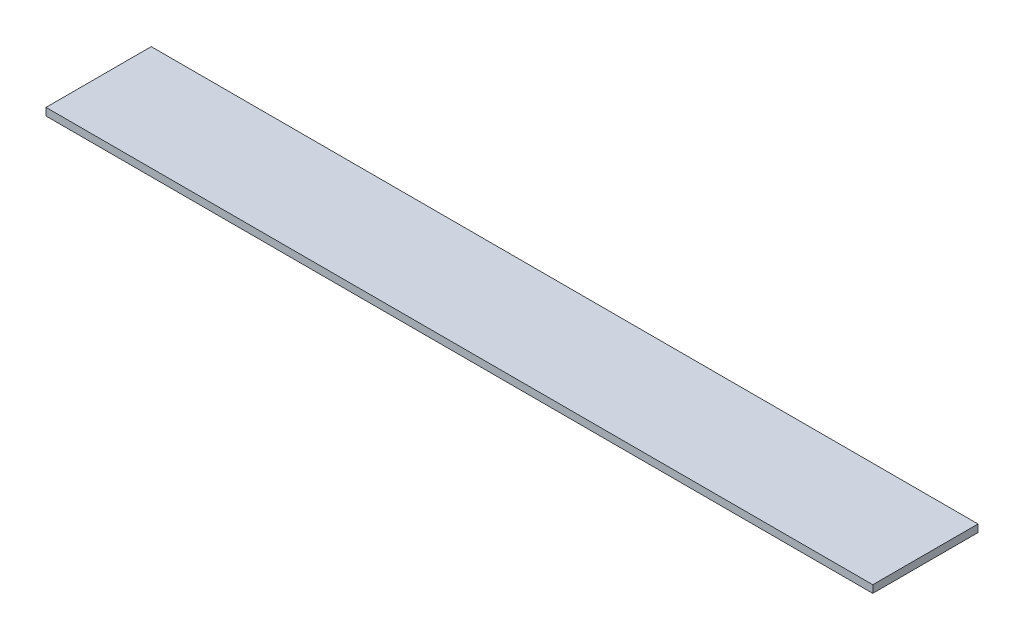
ISO-10303-21;
HEADER;
FILE_DESCRIPTION(('STEP AP214'),'2;1');
FILE_NAME('part.step','',(''),(''),'','','');
FILE_SCHEMA(('AUTOMOTIVE_DESIGN { 1 0 10303 214 1 1 1 1 }'));
ENDSEC;
DATA;
#1=APPLICATION_CONTEXT('core data for automotive mechanical design processes');
#2=APPLICATION_PROTOCOL_DEFINITION('international standard','automotive_design',2000,#1);
#3=PRODUCT_CONTEXT('',#1,'mechanical');
#4=PRODUCT('Part','Part','',(#3));
#5=PRODUCT_RELATED_PRODUCT_CATEGORY('part','',(#4));
#6=PRODUCT_DEFINITION_FORMATION('','',#4);
#7=PRODUCT_DEFINITION_CONTEXT('part definition',#1,'design');
#8=PRODUCT_DEFINITION('design','',#6,#7);
#9=PRODUCT_DEFINITION_SHAPE('','',#8);
#10=(LENGTH_UNIT() NAMED_UNIT(*) SI_UNIT(.MILLI.,.METRE.));
#11=(NAMED_UNIT(*) PLANE_ANGLE_UNIT() SI_UNIT($,.RADIAN.));
#12=(NAMED_UNIT(*) SI_UNIT($,.STERADIAN.) SOLID_ANGLE_UNIT());
#13=UNCERTAINTY_MEASURE_WITH_UNIT(LENGTH_MEASURE(1.E-05),#10,'distance_accuracy_value','');
#14=(GEOMETRIC_REPRESENTATION_CONTEXT(3) GLOBAL_UNCERTAINTY_ASSIGNED_CONTEXT((#13)) GLOBAL_UNIT_ASSIGNED_CONTEXT((#10,
#11,#12)) REPRESENTATION_CONTEXT('',''));
#15=CARTESIAN_POINT('',(0.,0.,0.));
#16=DIRECTION('',(0.,0.,1.));
#17=DIRECTION('',(1.,0.,0.));
#18=AXIS2_PLACEMENT_3D('',#15,#16,#17);
#19=CARTESIAN_POINT('',(698.500000000001,12.7,-88.9000000000002));
#20=DIRECTION('',(1.,0.,0.));
#21=DIRECTION('',(0.,0.,-1.));
#22=AXIS2_PLACEMENT_3D('',#19,#20,#21);
#23=PLANE('',#22);
#24=DIRECTION('',(0.,0.,1.));
#25=VECTOR('',#24,1.);
#26=CARTESIAN_POINT('',(698.500000000001,0.,-88.9000000000002));
#27=LINE('',#26,#25);
#28=CARTESIAN_POINT('',(698.500000000001,0.,-88.9000000000002));
#29=VERTEX_POINT('',#28);
#30=CARTESIAN_POINT('',(698.500000000001,0.,88.8999999999999));
#31=VERTEX_POINT('',#30);
#32=EDGE_CURVE('E98',#29,#31,#27,.T.);
#33=ORIENTED_EDGE('',*,*,#32,.F.);
#34=DIRECTION('',(0.,-1.,0.));
#35=VECTOR('',#34,1.);
#36=CARTESIAN_POINT('',(698.500000000001,12.7,-88.9000000000002));
#37=LINE('',#36,#35);
#38=CARTESIAN_POINT('',(698.500000000001,12.7,-88.9000000000002));
#39=VERTEX_POINT('',#38);
#40=EDGE_CURVE('E11',#39,#29,#37,.T.);
#41=ORIENTED_EDGE('',*,*,#40,.F.);
#42=DIRECTION('',(0.,0.,1.));
#43=VECTOR('',#42,1.);
#44=CARTESIAN_POINT('',(698.500000000001,12.7,-88.9000000000002));
#45=LINE('',#44,#43);
#46=CARTESIAN_POINT('',(698.500000000001,12.7,88.8999999999999));
#47=VERTEX_POINT('',#46);
#48=EDGE_CURVE('E93',#39,#47,#45,.T.);
#49=ORIENTED_EDGE('',*,*,#48,.T.);
#50=DIRECTION('',(0.,-1.,0.));
#51=VECTOR('',#50,1.);
#52=CARTESIAN_POINT('',(698.500000000001,12.7,88.8999999999999));
#53=LINE('',#52,#51);
#54=EDGE_CURVE('E36',#47,#31,#53,.T.);
#55=ORIENTED_EDGE('',*,*,#54,.T.);
#56=EDGE_LOOP('',(#33,#41,#49,#55));
#57=FACE_BOUND('',#56,.T.);
#58=ADVANCED_FACE('F33',(#57),#23,.T.);
#59=CARTESIAN_POINT('',(698.500000000001,12.7,-88.9000000000002));
#60=DIRECTION('',(0.,0.,1.));
#61=DIRECTION('',(1.,0.,0.));
#62=AXIS2_PLACEMENT_3D('',#59,#60,#61);
#63=PLANE('',#62);
#64=DIRECTION('',(-1.,0.,0.));
#65=VECTOR('',#64,1.);
#66=CARTESIAN_POINT('',(698.500000000001,0.,-88.9000000000002));
#67=LINE('',#66,#65);
#68=CARTESIAN_POINT('',(-698.499999999999,0.,-88.8999999999999));
#69=VERTEX_POINT('',#68);
#70=EDGE_CURVE('E66',#29,#69,#67,.T.);
#71=ORIENTED_EDGE('',*,*,#70,.T.);
#72=DIRECTION('',(0.,-1.,0.));
#73=VECTOR('',#72,1.);
#74=CARTESIAN_POINT('',(-698.499999999999,12.7,-88.8999999999999));
#75=LINE('',#74,#73);
#76=CARTESIAN_POINT('',(-698.499999999999,12.7,-88.8999999999999));
#77=VERTEX_POINT('',#76);
#78=EDGE_CURVE('E42',#77,#69,#75,.T.);
#79=ORIENTED_EDGE('',*,*,#78,.F.);
#80=DIRECTION('',(-1.,0.,0.));
#81=VECTOR('',#80,1.);
#82=CARTESIAN_POINT('',(698.500000000001,12.7,-88.9000000000002));
#83=LINE('',#82,#81);
#84=EDGE_CURVE('E83',#39,#77,#83,.T.);
#85=ORIENTED_EDGE('',*,*,#84,.F.);
#86=ORIENTED_EDGE('',*,*,#40,.T.);
#87=EDGE_LOOP('',(#71,#79,#85,#86));
#88=FACE_BOUND('',#87,.T.);
#89=ADVANCED_FACE('F108',(#88),#63,.F.);
#90=CARTESIAN_POINT('',(-698.499999999999,12.7,-88.8999999999999));
#91=DIRECTION('',(1.,0.,0.));
#92=DIRECTION('',(0.,0.,-1.));
#93=AXIS2_PLACEMENT_3D('',#90,#91,#92);
#94=PLANE('',#93);
#95=DIRECTION('',(0.,0.,1.));
#96=VECTOR('',#95,1.);
#97=CARTESIAN_POINT('',(-698.499999999999,0.,-88.8999999999999));
#98=LINE('',#97,#96);
#99=CARTESIAN_POINT('',(-698.499999999999,0.,88.9000000000001));
#100=VERTEX_POINT('',#99);
#101=EDGE_CURVE('E90',#69,#100,#98,.T.);
#102=ORIENTED_EDGE('',*,*,#101,.T.);
#103=DIRECTION('',(0.,-1.,0.));
#104=VECTOR('',#103,1.);
#105=CARTESIAN_POINT('',(-698.499999999999,12.7,88.9000000000001));
#106=LINE('',#105,#104);
#107=CARTESIAN_POINT('',(-698.499999999999,12.7,88.9000000000001));
#108=VERTEX_POINT('',#107);
#109=EDGE_CURVE('E87',#108,#100,#106,.T.);
#110=ORIENTED_EDGE('',*,*,#109,.F.);
#111=DIRECTION('',(0.,0.,1.));
#112=VECTOR('',#111,1.);
#113=CARTESIAN_POINT('',(-698.499999999999,12.7,-88.8999999999999));
#114=LINE('',#113,#112);
#115=EDGE_CURVE('E78',#77,#108,#114,.T.);
#116=ORIENTED_EDGE('',*,*,#115,.F.);
#117=ORIENTED_EDGE('',*,*,#78,.T.);
#118=EDGE_LOOP('',(#102,#110,#116,#117));
#119=FACE_BOUND('',#118,.T.);
#120=ADVANCED_FACE('F88',(#119),#94,.F.);
#121=CARTESIAN_POINT('',(698.500000000001,12.7,88.8999999999999));
#122=DIRECTION('',(0.,0.,1.));
#123=DIRECTION('',(1.,0.,0.));
#124=AXIS2_PLACEMENT_3D('',#121,#122,#123);
#125=PLANE('',#124);
#126=DIRECTION('',(-1.,0.,0.));
#127=VECTOR('',#126,1.);
#128=CARTESIAN_POINT('',(698.500000000001,0.,88.8999999999999));
#129=LINE('',#128,#127);
#130=EDGE_CURVE('E101',#31,#100,#129,.T.);
#131=ORIENTED_EDGE('',*,*,#130,.F.);
#132=ORIENTED_EDGE('',*,*,#54,.F.);
#133=DIRECTION('',(-1.,0.,0.));
#134=VECTOR('',#133,1.);
#135=CARTESIAN_POINT('',(698.500000000001,12.7,88.8999999999999));
#136=LINE('',#135,#134);
#137=EDGE_CURVE('E82',#47,#108,#136,.T.);
#138=ORIENTED_EDGE('',*,*,#137,.T.);
#139=ORIENTED_EDGE('',*,*,#109,.T.);
#140=EDGE_LOOP('',(#131,#132,#138,#139));
#141=FACE_BOUND('',#140,.T.);
#142=ADVANCED_FACE('F92',(#141),#125,.T.);
#143=CARTESIAN_POINT('',(0.,12.7,0.));
#144=DIRECTION('',(0.,-1.,0.));
#145=DIRECTION('',(0.,0.,-1.));
#146=AXIS2_PLACEMENT_3D('',#143,#144,#145);
#147=PLANE('',#146);
#148=ORIENTED_EDGE('',*,*,#48,.F.);
#149=ORIENTED_EDGE('',*,*,#84,.T.);
#150=ORIENTED_EDGE('',*,*,#115,.T.);
#151=ORIENTED_EDGE('',*,*,#137,.F.);
#152=EDGE_LOOP('',(#148,#149,#150,#151));
#153=FACE_BOUND('',#152,.T.);
#154=ADVANCED_FACE('F81',(#153),#147,.F.);
#155=CARTESIAN_POINT('',(0.,0.,0.));
#156=DIRECTION('',(0.,-1.,0.));
#157=DIRECTION('',(0.,0.,-1.));
#158=AXIS2_PLACEMENT_3D('',#155,#156,#157);
#159=PLANE('',#158);
#160=ORIENTED_EDGE('',*,*,#32,.T.);
#161=ORIENTED_EDGE('',*,*,#130,.T.);
#162=ORIENTED_EDGE('',*,*,#101,.F.);
#163=ORIENTED_EDGE('',*,*,#70,.F.);
#164=EDGE_LOOP('',(#160,#161,#162,#163));
#165=FACE_BOUND('',#164,.T.);
#166=ADVANCED_FACE('F106',(#165),#159,.T.);
#167=CLOSED_SHELL('',(#58,#89,#120,#142,#154,#166));
#168=MANIFOLD_SOLID_BREP('B2',#167);
#169=ADVANCED_BREP_SHAPE_REPRESENTATION('',(#18,#168),#14);
#170=SHAPE_DEFINITION_REPRESENTATION(#9,#169);
ENDSEC;
END-ISO-10303-21;
